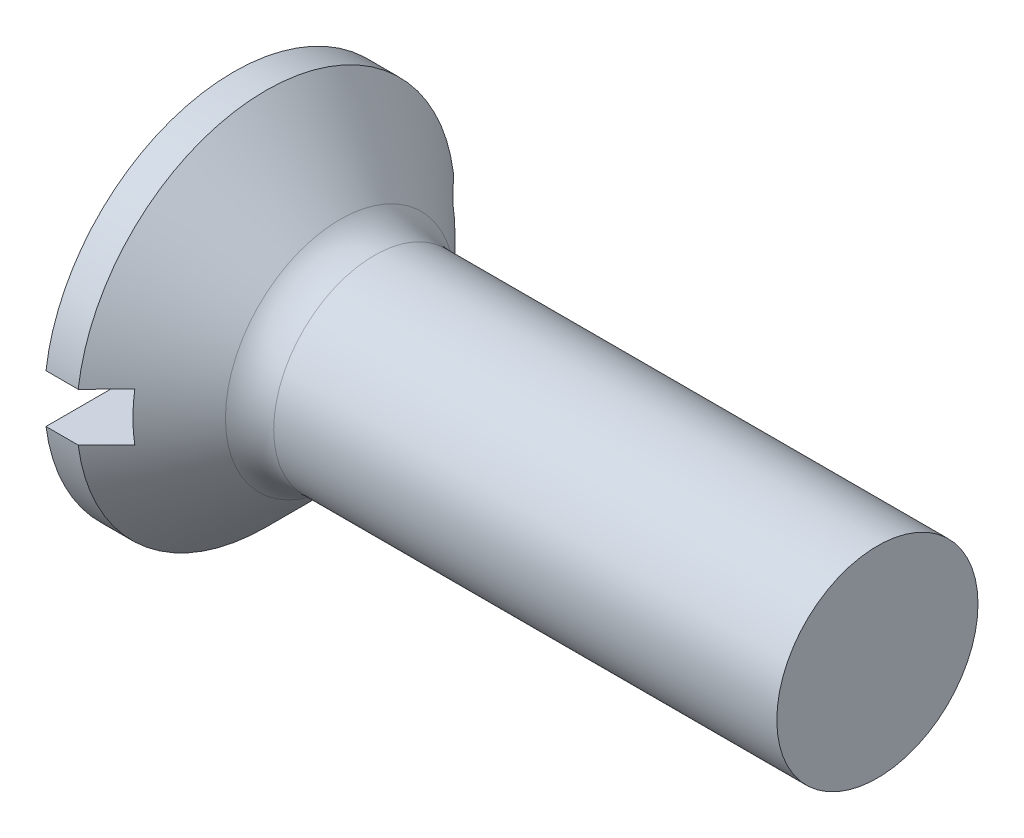
ISO-10303-21;
HEADER;
FILE_DESCRIPTION(('STEP AP214'),'2;1');
FILE_NAME('part.step','',(''),(''),'','','');
FILE_SCHEMA(('AUTOMOTIVE_DESIGN { 1 0 10303 214 1 1 1 1 }'));
ENDSEC;
DATA;
#1=APPLICATION_CONTEXT('core data for automotive mechanical design processes');
#2=APPLICATION_PROTOCOL_DEFINITION('international standard','automotive_design',2000,#1);
#3=PRODUCT_CONTEXT('',#1,'mechanical');
#4=PRODUCT('Part','Part','',(#3));
#5=PRODUCT_RELATED_PRODUCT_CATEGORY('part','',(#4));
#6=PRODUCT_DEFINITION_FORMATION('','',#4);
#7=PRODUCT_DEFINITION_CONTEXT('part definition',#1,'design');
#8=PRODUCT_DEFINITION('design','',#6,#7);
#9=PRODUCT_DEFINITION_SHAPE('','',#8);
#10=(LENGTH_UNIT() NAMED_UNIT(*) SI_UNIT(.MILLI.,.METRE.));
#11=(NAMED_UNIT(*) PLANE_ANGLE_UNIT() SI_UNIT($,.RADIAN.));
#12=(NAMED_UNIT(*) SI_UNIT($,.STERADIAN.) SOLID_ANGLE_UNIT());
#13=UNCERTAINTY_MEASURE_WITH_UNIT(LENGTH_MEASURE(1.E-05),#10,'distance_accuracy_value','');
#14=(GEOMETRIC_REPRESENTATION_CONTEXT(3) GLOBAL_UNCERTAINTY_ASSIGNED_CONTEXT((#13)) GLOBAL_UNIT_ASSIGNED_CONTEXT((#10,
#11,#12)) REPRESENTATION_CONTEXT('',''));
#15=CARTESIAN_POINT('',(0.,0.,0.));
#16=DIRECTION('',(0.,0.,1.));
#17=DIRECTION('',(1.,0.,0.));
#18=AXIS2_PLACEMENT_3D('',#15,#16,#17);
#19=CARTESIAN_POINT('',(0.,0.,0.));
#20=DIRECTION('',(-1.,0.,0.));
#21=DIRECTION('',(0.,0.,1.));
#22=AXIS2_PLACEMENT_3D('',#19,#20,#21);
#23=PLANE('',#22);
#24=DIRECTION('',(0.,0.,-1.));
#25=VECTOR('',#24,1.);
#26=CARTESIAN_POINT('',(0.,0.3,2.35));
#27=LINE('',#26,#25);
#28=CARTESIAN_POINT('',(0.,0.3,2.33077240416133));
#29=VERTEX_POINT('',#28);
#30=CARTESIAN_POINT('',(0.,0.3,-2.33077240416133));
#31=VERTEX_POINT('',#30);
#32=EDGE_CURVE('E172',#29,#31,#27,.T.);
#33=ORIENTED_EDGE('',*,*,#32,.F.);
#34=CARTESIAN_POINT('',(0.,0.,0.));
#35=DIRECTION('',(-1.,0.,0.));
#36=DIRECTION('',(0.,0.,1.));
#37=AXIS2_PLACEMENT_3D('',#34,#35,#36);
#38=CIRCLE('',#37,2.35);
#39=EDGE_CURVE('E116',#29,#31,#38,.T.);
#40=ORIENTED_EDGE('',*,*,#39,.T.);
#41=EDGE_LOOP('',(#33,#40));
#42=FACE_BOUND('',#41,.T.);
#43=ADVANCED_FACE('F35',(#42),#23,.T.);
#44=CARTESIAN_POINT('',(-6.34999999999999,0.,0.));
#45=DIRECTION('',(-1.,0.,0.));
#46=DIRECTION('',(0.,0.,1.));
#47=AXIS2_PLACEMENT_3D('',#44,#45,#46);
#48=CYLINDRICAL_SURFACE('',#47,2.35);
#49=DIRECTION('',(-1.,0.,0.));
#50=VECTOR('',#49,1.);
#51=CARTESIAN_POINT('',(-6.34999999999999,0.3,-2.33077240416133));
#52=LINE('',#51,#50);
#53=CARTESIAN_POINT('',(0.399999999999993,0.3,-2.33077240416135));
#54=VERTEX_POINT('',#53);
#55=EDGE_CURVE('E63',#31,#54,#52,.F.);
#56=ORIENTED_EDGE('',*,*,#55,.F.);
#57=ORIENTED_EDGE('',*,*,#39,.F.);
#58=DIRECTION('',(-1.,0.,0.));
#59=VECTOR('',#58,1.);
#60=CARTESIAN_POINT('',(-6.34999999999999,0.3,2.33077240416133));
#61=LINE('',#60,#59);
#62=CARTESIAN_POINT('',(0.400000000000005,0.3,2.33077240416133));
#63=VERTEX_POINT('',#62);
#64=EDGE_CURVE('E178',#63,#29,#61,.T.);
#65=ORIENTED_EDGE('',*,*,#64,.F.);
#66=CARTESIAN_POINT('',(0.400000000000005,0.,0.));
#67=DIRECTION('',(-1.,0.,0.));
#68=DIRECTION('',(0.,0.,1.));
#69=AXIS2_PLACEMENT_3D('',#66,#67,#68);
#70=CIRCLE('',#69,2.35);
#71=EDGE_CURVE('E110',#63,#54,#70,.T.);
#72=ORIENTED_EDGE('',*,*,#71,.T.);
#73=EDGE_LOOP('',(#56,#57,#65,#72));
#74=FACE_BOUND('',#73,.T.);
#75=ADVANCED_FACE('F156',(#74),#48,.T.);
#76=DIRECTION('',(0.,0.,1.));
#77=VECTOR('',#76,1.);
#78=CARTESIAN_POINT('',(0.,-0.300000000000001,-2.35));
#79=LINE('',#78,#77);
#80=CARTESIAN_POINT('',(0.,-0.300000000000001,-2.33077240416133));
#81=VERTEX_POINT('',#80);
#82=CARTESIAN_POINT('',(0.,-0.300000000000001,2.33077240416133));
#83=VERTEX_POINT('',#82);
#84=EDGE_CURVE('E104',#81,#83,#79,.T.);
#85=ORIENTED_EDGE('',*,*,#84,.F.);
#86=EDGE_CURVE('E112',#81,#83,#38,.T.);
#87=ORIENTED_EDGE('',*,*,#86,.T.);
#88=EDGE_LOOP('',(#85,#87));
#89=FACE_BOUND('',#88,.T.);
#90=ADVANCED_FACE('F158',(#89),#23,.T.);
#91=DIRECTION('',(-1.,0.,0.));
#92=VECTOR('',#91,1.);
#93=CARTESIAN_POINT('',(-6.34999999999999,-0.300000000000001,2.33077240416133));
#94=LINE('',#93,#92);
#95=CARTESIAN_POINT('',(0.399999999999993,-0.300000000000001,2.33077240416135));
#96=VERTEX_POINT('',#95);
#97=EDGE_CURVE('E177',#83,#96,#94,.F.);
#98=ORIENTED_EDGE('',*,*,#97,.F.);
#99=ORIENTED_EDGE('',*,*,#86,.F.);
#100=DIRECTION('',(-1.,0.,0.));
#101=VECTOR('',#100,1.);
#102=CARTESIAN_POINT('',(-6.34999999999999,-0.300000000000001,-2.33077240416133));
#103=LINE('',#102,#101);
#104=CARTESIAN_POINT('',(0.400000000000005,-0.300000000000001,-2.33077240416133));
#105=VERTEX_POINT('',#104);
#106=EDGE_CURVE('E175',#105,#81,#103,.T.);
#107=ORIENTED_EDGE('',*,*,#106,.F.);
#108=EDGE_CURVE('E113',#105,#96,#70,.T.);
#109=ORIENTED_EDGE('',*,*,#108,.T.);
#110=EDGE_LOOP('',(#98,#99,#107,#109));
#111=FACE_BOUND('',#110,.T.);
#112=ADVANCED_FACE('F153',(#111),#48,.T.);
#113=CARTESIAN_POINT('',(0.400000000000005,0.,0.));
#114=DIRECTION('',(-1.,0.,0.));
#115=DIRECTION('',(0.,0.,1.));
#116=AXIS2_PLACEMENT_3D('',#113,#114,#115);
#117=CONICAL_SURFACE('',#116,2.35,0.78539816339745);
#118=CARTESIAN_POINT('',(-2.42800833862551,0.299999999999999,-5.16931043320823));
#119=CARTESIAN_POINT('',(-2.25261841100847,0.299999999999999,-4.99362307651959));
#120=CARTESIAN_POINT('',(-2.07724133757269,0.299999999999999,-4.81792287797167));
#121=CARTESIAN_POINT('',(-1.72652707610118,0.299999999999999,-4.46647837873486));
#122=CARTESIAN_POINT('',(-1.55118988858094,0.299999999999999,-4.29073407753154));
#123=CARTESIAN_POINT('',(-1.20052586084608,0.299999999999999,-3.93913911764998));
#124=CARTESIAN_POINT('',(-1.02519903662008,0.299999999999999,-3.76328844302492));
#125=CARTESIAN_POINT('',(-0.674635250353659,0.299999999999999,-3.41150171139461));
#126=CARTESIAN_POINT('',(-0.499398287263219,0.299999999999999,-3.23556565543604));
#127=CARTESIAN_POINT('',(-0.142742244781546,0.3,-2.87719891061078));
#128=CARTESIAN_POINT('',(0.038671636456695,0.3,-2.69476304903183));
#129=CARTESIAN_POINT('',(0.401243177518264,0.3,-2.32962368901913));
#130=CARTESIAN_POINT('',(0.582400828029133,0.3,-2.14692018132558));
#131=CARTESIAN_POINT('',(0.853701856085655,0.3,-1.87246633098782));
#132=CARTESIAN_POINT('',(0.944055005364719,0.3,-1.78092337661133));
#133=CARTESIAN_POINT('',(1.12454060462918,0.3,-1.59761714970683));
#134=CARTESIAN_POINT('',(1.21467305140061,0.3,-1.50585387400849));
#135=CARTESIAN_POINT('',(1.39455527575801,0.3,-1.32196522643919));
#136=CARTESIAN_POINT('',(1.48430507822803,0.3,-1.229839878887));
#137=CARTESIAN_POINT('',(1.66312457215175,0.3,-1.04493203292002));
#138=CARTESIAN_POINT('',(1.75219428539218,0.3,-0.952149555741564));
#139=CARTESIAN_POINT('',(1.86420471650147,0.3,-0.833484886776327));
#140=CARTESIAN_POINT('',(1.88787598239781,0.3,-0.808293333926217));
#141=CARTESIAN_POINT('',(1.93506265122317,0.3,-0.757763761833925));
#142=CARTESIAN_POINT('',(1.95857805168588,0.3,-0.732425740285937));
#143=CARTESIAN_POINT('',(2.00531964433951,0.3,-0.681650032077844));
#144=CARTESIAN_POINT('',(2.02854656685492,0.3,-0.656213018523777));
#145=CARTESIAN_POINT('',(2.07471756896195,0.3,-0.605084358958985));
#146=CARTESIAN_POINT('',(2.09766165859694,0.3,-0.579392722048694));
#147=CARTESIAN_POINT('',(2.15086468280879,0.3,-0.51888076915938));
#148=CARTESIAN_POINT('',(2.18096450936673,0.3,-0.483920434861271));
#149=CARTESIAN_POINT('',(2.24014710244929,0.3,-0.412740209784395));
#150=CARTESIAN_POINT('',(2.26922201299974,0.3,-0.376513624206164));
#151=CARTESIAN_POINT('',(2.31115781909481,0.3,-0.320521065908703));
#152=CARTESIAN_POINT('',(2.32494116764219,0.3,-0.301451693578296));
#153=CARTESIAN_POINT('',(2.35155128112178,0.3,-0.26260920096928));
#154=CARTESIAN_POINT('',(2.36437673279242,0.3,-0.242835167515917));
#155=CARTESIAN_POINT('',(2.38838369538092,0.3,-0.202548926305904));
#156=CARTESIAN_POINT('',(2.39957972481182,0.3,-0.182045562457895));
#157=CARTESIAN_POINT('',(2.41950326781518,0.3,-0.139898499194679));
#158=CARTESIAN_POINT('',(2.42823853712242,0.3,-0.118258643496494));
#159=CARTESIAN_POINT('',(2.44121464752116,0.3,-0.0756315642330676));
#160=CARTESIAN_POINT('',(2.44577820345638,0.3,-0.0547490856512851));
#161=CARTESIAN_POINT('',(2.45045814550033,0.3,-0.0125607157781819));
#162=CARTESIAN_POINT('',(2.45059819009942,0.3,0.00874231302403852));
#163=CARTESIAN_POINT('',(2.44645713359358,0.3,0.0507745005940994));
#164=CARTESIAN_POINT('',(2.44219645792767,0.3,0.0715058561744324));
#165=CARTESIAN_POINT('',(2.43034285129266,0.3,0.112088788803905));
#166=CARTESIAN_POINT('',(2.42272600867115,0.3,0.131932906155933));
#167=CARTESIAN_POINT('',(2.40627133282176,0.3,0.168480395150473));
#168=CARTESIAN_POINT('',(2.39765896034616,0.3,0.185289560929076));
#169=CARTESIAN_POINT('',(2.3792568253778,0.3,0.218258180915777));
#170=CARTESIAN_POINT('',(2.36946608782077,0.3,0.234417082090524));
#171=CARTESIAN_POINT('',(2.33884369453563,0.3,0.282238068331407));
#172=CARTESIAN_POINT('',(2.3168212428878,0.3,0.313127668084709));
#173=CARTESIAN_POINT('',(2.27098335225628,0.3,0.37396790322838));
#174=CARTESIAN_POINT('',(2.24715273675021,0.3,0.403906685116859));
#175=CARTESIAN_POINT('',(2.19860686699748,0.3,0.462939798598314));
#176=CARTESIAN_POINT('',(2.17389378650274,0.3,0.492035923296734));
#177=CARTESIAN_POINT('',(2.09996652239785,0.3,0.577366539181614));
#178=CARTESIAN_POINT('',(2.04995461423282,0.3,0.632904277681994));
#179=CARTESIAN_POINT('',(1.94893899770814,0.3,0.74307551175472));
#180=CARTESIAN_POINT('',(1.89793511720108,0.3,0.797708847275651));
#181=CARTESIAN_POINT('',(1.79530712664028,0.3,0.906513436614064));
#182=CARTESIAN_POINT('',(1.74368234705581,0.3,0.960684058808777));
#183=CARTESIAN_POINT('',(1.64009874735041,0.3,1.06869576204129));
#184=CARTESIAN_POINT('',(1.58813995368372,0.3,1.12253686853349));
#185=CARTESIAN_POINT('',(1.43299775678761,0.3,1.28265340811134));
#186=CARTESIAN_POINT('',(1.3294988376074,0.3,1.38862292108423));
#187=CARTESIAN_POINT('',(1.12213953407125,0.3,1.60010735015039));
#188=CARTESIAN_POINT('',(1.0182793454916,0.3,1.70562245882804));
#189=CARTESIAN_POINT('',(0.776938614120301,0.3,1.95025555867546));
#190=CARTESIAN_POINT('',(0.639369380971761,0.3,2.08928605536231));
#191=CARTESIAN_POINT('',(0.364008005227606,0.3,2.36712673194879));
#192=CARTESIAN_POINT('',(0.226215861930196,0.3,2.50593691115206));
#193=CARTESIAN_POINT('',(-0.187415945932266,0.3,2.92222808567334));
#194=CARTESIAN_POINT('',(-0.463453894992341,0.3,3.19951203803216));
#195=CARTESIAN_POINT('',(-1.02086601908128,0.3,3.7589880811749));
#196=CARTESIAN_POINT('',(-1.30224437603958,0.3,4.04117600158046));
#197=CARTESIAN_POINT('',(-1.86507745571824,0.3,4.60535323076595));
#198=CARTESIAN_POINT('',(-2.14653214851341,0.3,4.88734256939645));
#199=CARTESIAN_POINT('',(-2.42800833862551,0.3,5.16931043320823));
#200=B_SPLINE_CURVE_WITH_KNOTS('',3,(#118,#119,#120,#121,#122,#123,#124,#125,#126,#127,#128,
#129,#130,#131,#132,#133,#134,#135,#136,#137,#138,#139,#140,#141,#142,#143,#144,#145,#146,#147,
#148,#149,#150,#151,#152,#153,#154,#155,#156,#157,#158,#159,#160,#161,#162,#163,#164,#165,#166,
#167,#168,#169,#170,#171,#172,#173,#174,#175,#176,#177,#178,#179,#180,#181,#182,#183,#184,#185,
#186,#187,#188,#189,#190,#191,#192,#193,#194,#195,#196,#197,#198,#199),.UNSPECIFIED.,.F.,.F.,(4,
2,2,2,2,2,2,2,2,2,2,2,2,2,2,2,2,2,2,2,2,2,2,2,2,2,2,2,2,2,2,2,2,2,2,2,2,2,2,2,4),(0.,
0.744747662727134,1.48950445855312,2.23446524668655,2.97941712212032,3.75126198924283,
4.52313422235859,4.90900225921791,5.29487588223297,5.68072401625056,6.06655973727287,
6.17026308463778,6.27396806903843,6.37730491095521,6.48063807275887,6.61902727243693,
6.75831338375107,6.82888195451737,6.89954556231686,6.96953490884326,7.03930113238932,
7.10304879020665,7.16645544512716,7.22956912206529,7.29313992454909,7.3497401687446,
7.40638757429911,7.5200731788173,7.63484962030853,7.74936057357199,7.97354071854587,
8.19776012127105,8.42224800229592,8.64671831749125,9.09109579101219,9.53526148150464,
10.1220256602753,10.7087916899865,11.8825672231515,13.078073058125,14.2733188423756),.UNSPECIFIED.);
#201=CARTESIAN_POINT('',(0.75,0.3,1.97737199332852));
#202=VERTEX_POINT('',#201);
#203=EDGE_CURVE('E11',#202,#63,#200,.T.);
#204=ORIENTED_EDGE('',*,*,#203,.F.);
#205=CARTESIAN_POINT('',(0.75,0.,0.));
#206=DIRECTION('',(1.,0.,0.));
#207=DIRECTION('',(0.,0.,-1.));
#208=AXIS2_PLACEMENT_3D('',#205,#206,#207);
#209=CIRCLE('',#208,2.);
#210=CARTESIAN_POINT('',(0.75,-0.300000000000001,1.97737199332852));
#211=VERTEX_POINT('',#210);
#212=EDGE_CURVE('E92',#211,#202,#209,.F.);
#213=ORIENTED_EDGE('',*,*,#212,.F.);
#214=CARTESIAN_POINT('',(-2.42800833862551,-0.300000000000001,5.16931043320823));
#215=CARTESIAN_POINT('',(-2.25261841100847,-0.300000000000001,4.9936230765196));
#216=CARTESIAN_POINT('',(-2.0772413375727,-0.300000000000001,4.81792287797168));
#217=CARTESIAN_POINT('',(-1.72652707610118,-0.300000000000001,4.46647837873486));
#218=CARTESIAN_POINT('',(-1.55118988858094,-0.300000000000001,4.29073407753154));
#219=CARTESIAN_POINT('',(-1.20052586084608,-0.300000000000001,3.93913911764998));
#220=CARTESIAN_POINT('',(-1.02519903662009,-0.300000000000001,3.76328844302492));
#221=CARTESIAN_POINT('',(-0.674635250353662,-0.300000000000001,3.41150171139461));
#222=CARTESIAN_POINT('',(-0.499398287263222,-0.300000000000001,3.23556565543605));
#223=CARTESIAN_POINT('',(-0.142742244781549,-0.300000000000001,2.87719891061079));
#224=CARTESIAN_POINT('',(0.0386716364566927,-0.300000000000001,2.69476304903183));
#225=CARTESIAN_POINT('',(0.401243177518262,-0.300000000000001,2.32962368901913));
#226=CARTESIAN_POINT('',(0.582400828029131,-0.300000000000001,2.14692018132558));
#227=CARTESIAN_POINT('',(0.853701856085653,-0.300000000000001,1.87246633098782));
#228=CARTESIAN_POINT('',(0.944055005364718,-0.300000000000001,1.78092337661133));
#229=CARTESIAN_POINT('',(1.12454060462918,-0.300000000000001,1.59761714970683));
#230=CARTESIAN_POINT('',(1.21467305140061,-0.300000000000001,1.50585387400849));
#231=CARTESIAN_POINT('',(1.39455527575801,-0.300000000000001,1.32196522643919));
#232=CARTESIAN_POINT('',(1.48430507822803,-0.300000000000001,1.229839878887));
#233=CARTESIAN_POINT('',(1.66312457215175,-0.300000000000001,1.04493203292002));
#234=CARTESIAN_POINT('',(1.75219428539218,-0.300000000000001,0.952149555741564));
#235=CARTESIAN_POINT('',(1.86420471650147,-0.300000000000001,0.833484886776327));
#236=CARTESIAN_POINT('',(1.8878759823978,-0.300000000000001,0.808293333926217));
#237=CARTESIAN_POINT('',(1.93506265122317,-0.300000000000001,0.757763761833925));
#238=CARTESIAN_POINT('',(1.95857805168588,-0.300000000000001,0.732425740285938));
#239=CARTESIAN_POINT('',(2.00531964433951,-0.300000000000001,0.681650032077844));
#240=CARTESIAN_POINT('',(2.02854656685492,-0.300000000000001,0.656213018523777));
#241=CARTESIAN_POINT('',(2.07471756896195,-0.300000000000001,0.605084358958985));
#242=CARTESIAN_POINT('',(2.09766165859694,-0.300000000000001,0.579392722048694));
#243=CARTESIAN_POINT('',(2.15086468280879,-0.300000000000001,0.51888076915938));
#244=CARTESIAN_POINT('',(2.18096450936673,-0.300000000000001,0.48392043486127));
#245=CARTESIAN_POINT('',(2.24014710244929,-0.300000000000001,0.412740209784394));
#246=CARTESIAN_POINT('',(2.26922201299974,-0.300000000000001,0.376513624206163));
#247=CARTESIAN_POINT('',(2.31115781909481,-0.300000000000001,0.320521065908702));
#248=CARTESIAN_POINT('',(2.32494116764219,-0.300000000000001,0.301451693578294));
#249=CARTESIAN_POINT('',(2.35155128112178,-0.300000000000001,0.262609200969279));
#250=CARTESIAN_POINT('',(2.36437673279242,-0.300000000000001,0.242835167515916));
#251=CARTESIAN_POINT('',(2.38838369538092,-0.300000000000001,0.202548926305904));
#252=CARTESIAN_POINT('',(2.39957972481182,-0.300000000000001,0.182045562457894));
#253=CARTESIAN_POINT('',(2.41950326781518,-0.300000000000001,0.139898499194678));
#254=CARTESIAN_POINT('',(2.42823853712242,-0.300000000000001,0.118258643496493));
#255=CARTESIAN_POINT('',(2.44121464752116,-0.300000000000001,0.0756315642330665));
#256=CARTESIAN_POINT('',(2.44577820345638,-0.300000000000001,0.054749085651284));
#257=CARTESIAN_POINT('',(2.45045814550033,-0.300000000000001,0.0125607157781809));
#258=CARTESIAN_POINT('',(2.45059819009942,-0.300000000000001,-0.00874231302403949));
#259=CARTESIAN_POINT('',(2.44645713359358,-0.300000000000001,-0.0507745005941003));
#260=CARTESIAN_POINT('',(2.44219645792767,-0.300000000000001,-0.0715058561744333));
#261=CARTESIAN_POINT('',(2.43034285129266,-0.300000000000001,-0.112088788803905));
#262=CARTESIAN_POINT('',(2.42272600867114,-0.300000000000001,-0.131932906155934));
#263=CARTESIAN_POINT('',(2.40627133282176,-0.300000000000001,-0.168480395150474));
#264=CARTESIAN_POINT('',(2.39765896034615,-0.300000000000001,-0.185289560929078));
#265=CARTESIAN_POINT('',(2.3792568253778,-0.300000000000001,-0.218258180915779));
#266=CARTESIAN_POINT('',(2.36946608782076,-0.300000000000001,-0.234417082090525));
#267=CARTESIAN_POINT('',(2.33884369453563,-0.300000000000001,-0.282238068331409));
#268=CARTESIAN_POINT('',(2.3168212428878,-0.300000000000001,-0.313127668084711));
#269=CARTESIAN_POINT('',(2.27098335225628,-0.300000000000001,-0.373967903228382));
#270=CARTESIAN_POINT('',(2.2471527367502,-0.300000000000001,-0.403906685116861));
#271=CARTESIAN_POINT('',(2.19860686699748,-0.300000000000001,-0.462939798598316));
#272=CARTESIAN_POINT('',(2.17389378650273,-0.300000000000001,-0.492035923296737));
#273=CARTESIAN_POINT('',(2.09996652239784,-0.300000000000001,-0.577366539181617));
#274=CARTESIAN_POINT('',(2.04995461423282,-0.300000000000001,-0.632904277681997));
#275=CARTESIAN_POINT('',(1.94893899770814,-0.300000000000001,-0.743075511754724));
#276=CARTESIAN_POINT('',(1.89793511720108,-0.300000000000001,-0.797708847275656));
#277=CARTESIAN_POINT('',(1.79530712664027,-0.300000000000001,-0.90651343661407));
#278=CARTESIAN_POINT('',(1.74368234705581,-0.300000000000001,-0.960684058808783));
#279=CARTESIAN_POINT('',(1.64009874735041,-0.300000000000001,-1.06869576204129));
#280=CARTESIAN_POINT('',(1.58813995368371,-0.300000000000001,-1.1225368685335));
#281=CARTESIAN_POINT('',(1.4329977567876,-0.300000000000001,-1.28265340811134));
#282=CARTESIAN_POINT('',(1.32949883760739,-0.300000000000001,-1.38862292108423));
#283=CARTESIAN_POINT('',(1.12213953407124,-0.300000000000001,-1.6001073501504));
#284=CARTESIAN_POINT('',(1.01827934549159,-0.300000000000001,-1.70562245882805));
#285=CARTESIAN_POINT('',(0.776938614120291,-0.300000000000001,-1.95025555867546));
#286=CARTESIAN_POINT('',(0.639369380971752,-0.300000000000001,-2.08928605536231));
#287=CARTESIAN_POINT('',(0.364008005227598,-0.300000000000001,-2.3671267319488));
#288=CARTESIAN_POINT('',(0.226215861930187,-0.300000000000001,-2.50593691115207));
#289=CARTESIAN_POINT('',(-0.187415945932274,-0.300000000000001,-2.92222808567335));
#290=CARTESIAN_POINT('',(-0.463453894992349,-0.300000000000001,-3.19951203803217));
#291=CARTESIAN_POINT('',(-1.02086601908129,-0.300000000000001,-3.75898808117491));
#292=CARTESIAN_POINT('',(-1.30224437603959,-0.300000000000001,-4.04117600158047));
#293=CARTESIAN_POINT('',(-1.86507745571824,-0.300000000000001,-4.60535323076595));
#294=CARTESIAN_POINT('',(-2.14653214851341,-0.300000000000001,-4.88734256939645));
#295=CARTESIAN_POINT('',(-2.42800833862551,-0.300000000000001,-5.16931043320823));
#296=B_SPLINE_CURVE_WITH_KNOTS('',3,(#214,#215,#216,#217,#218,#219,#220,#221,#222,#223,#224,
#225,#226,#227,#228,#229,#230,#231,#232,#233,#234,#235,#236,#237,#238,#239,#240,#241,#242,#243,
#244,#245,#246,#247,#248,#249,#250,#251,#252,#253,#254,#255,#256,#257,#258,#259,#260,#261,#262,
#263,#264,#265,#266,#267,#268,#269,#270,#271,#272,#273,#274,#275,#276,#277,#278,#279,#280,#281,
#282,#283,#284,#285,#286,#287,#288,#289,#290,#291,#292,#293,#294,#295),.UNSPECIFIED.,.F.,.F.,(4,
2,2,2,2,2,2,2,2,2,2,2,2,2,2,2,2,2,2,2,2,2,2,2,2,2,2,2,2,2,2,2,2,2,2,2,2,2,2,2,4),(0.,
0.744747662727132,1.48950445855311,2.23446524668655,2.97941712212031,3.75126198924283,
4.52313422235859,4.9090022592179,5.29487588223297,5.68072401625056,6.06655973727287,
6.17026308463778,6.27396806903843,6.37730491095521,6.48063807275887,6.61902727243693,
6.75831338375107,6.82888195451738,6.89954556231686,6.96953490884326,7.03930113238933,
7.10304879020665,7.16645544512716,7.22956912206529,7.29313992454909,7.3497401687446,
7.40638757429911,7.5200731788173,7.63484962030853,7.74936057357199,7.97354071854587,
8.19776012127106,8.42224800229593,8.64671831749126,9.0910957910122,9.53526148150465,
10.1220256602753,10.7087916899866,11.8825672231515,13.078073058125,14.2733188423756),.UNSPECIFIED.);
#297=EDGE_CURVE('E49',#96,#211,#296,.T.);
#298=ORIENTED_EDGE('',*,*,#297,.F.);
#299=ORIENTED_EDGE('',*,*,#108,.F.);
#300=CARTESIAN_POINT('',(0.75,-0.300000000000001,-1.97737199332852));
#301=VERTEX_POINT('',#300);
#302=EDGE_CURVE('E128',#301,#105,#296,.T.);
#303=ORIENTED_EDGE('',*,*,#302,.F.);
#304=CARTESIAN_POINT('',(0.75,0.3,-1.97737199332852));
#305=VERTEX_POINT('',#304);
#306=EDGE_CURVE('E100',#305,#301,#209,.F.);
#307=ORIENTED_EDGE('',*,*,#306,.F.);
#308=EDGE_CURVE('E39',#54,#305,#200,.T.);
#309=ORIENTED_EDGE('',*,*,#308,.F.);
#310=ORIENTED_EDGE('',*,*,#71,.F.);
#311=EDGE_LOOP('',(#204,#213,#298,#299,#303,#307,#309,#310));
#312=FACE_BOUND('',#311,.T.);
#313=CARTESIAN_POINT('',(1.32426406871193,0.,0.));
#314=DIRECTION('',(-1.,0.,0.));
#315=DIRECTION('',(0.,0.,1.));
#316=AXIS2_PLACEMENT_3D('',#313,#314,#315);
#317=CIRCLE('',#316,1.42573593128807);
#318=CARTESIAN_POINT('',(1.32426406871193,0.,1.42573593128807));
#319=VERTEX_POINT('',#318);
#320=EDGE_CURVE('E123',#319,#319,#317,.T.);
#321=ORIENTED_EDGE('',*,*,#320,.T.);
#322=EDGE_LOOP('',(#321));
#323=FACE_BOUND('',#322,.T.);
#324=ADVANCED_FACE('F107',(#312,#323),#117,.T.);
#325=CARTESIAN_POINT('',(-6.34999999999999,0.,0.));
#326=DIRECTION('',(-1.,0.,0.));
#327=DIRECTION('',(0.,0.,1.));
#328=AXIS2_PLACEMENT_3D('',#325,#326,#327);
#329=CYLINDRICAL_SURFACE('',#328,1.25);
#330=CARTESIAN_POINT('',(1.74852813742386,0.,0.));
#331=DIRECTION('',(-1.,0.,0.));
#332=DIRECTION('',(0.,0.,1.));
#333=AXIS2_PLACEMENT_3D('',#330,#331,#332);
#334=CIRCLE('',#333,1.25);
#335=CARTESIAN_POINT('',(1.74852813742386,0.,1.25));
#336=VERTEX_POINT('',#335);
#337=EDGE_CURVE('E126',#336,#336,#334,.F.);
#338=ORIENTED_EDGE('',*,*,#337,.T.);
#339=EDGE_LOOP('',(#338));
#340=FACE_BOUND('',#339,.T.);
#341=CARTESIAN_POINT('',(8.,0.,0.));
#342=DIRECTION('',(-1.,0.,0.));
#343=DIRECTION('',(0.,0.,1.));
#344=AXIS2_PLACEMENT_3D('',#341,#342,#343);
#345=CIRCLE('',#344,1.25);
#346=CARTESIAN_POINT('',(8.,0.,1.25));
#347=VERTEX_POINT('',#346);
#348=EDGE_CURVE('E119',#347,#347,#345,.T.);
#349=ORIENTED_EDGE('',*,*,#348,.T.);
#350=EDGE_LOOP('',(#349));
#351=FACE_BOUND('',#350,.T.);
#352=ADVANCED_FACE('F146',(#340,#351),#329,.T.);
#353=CARTESIAN_POINT('',(8.,1.25,0.));
#354=DIRECTION('',(1.,0.,0.));
#355=DIRECTION('',(0.,0.,-1.));
#356=AXIS2_PLACEMENT_3D('',#353,#354,#355);
#357=PLANE('',#356);
#358=ORIENTED_EDGE('',*,*,#348,.F.);
#359=EDGE_LOOP('',(#358));
#360=FACE_BOUND('',#359,.T.);
#361=ADVANCED_FACE('F144',(#360),#357,.T.);
#362=CARTESIAN_POINT('',(1.74852813742386,0.,0.));
#363=DIRECTION('',(-1.,0.,0.));
#364=DIRECTION('',(0.,0.,1.));
#365=AXIS2_PLACEMENT_3D('',#362,#363,#364);
#366=TOROIDAL_SURFACE('',#365,1.85,0.6);
#367=ORIENTED_EDGE('',*,*,#337,.F.);
#368=EDGE_LOOP('',(#367));
#369=FACE_BOUND('',#368,.T.);
#370=ORIENTED_EDGE('',*,*,#320,.F.);
#371=EDGE_LOOP('',(#370));
#372=FACE_BOUND('',#371,.T.);
#373=ADVANCED_FACE('F37',(#369,#372),#366,.F.);
#374=CARTESIAN_POINT('',(0.75,0.3,2.35));
#375=DIRECTION('',(0.,1.,0.));
#376=DIRECTION('',(0.,0.,1.));
#377=AXIS2_PLACEMENT_3D('',#374,#375,#376);
#378=PLANE('',#377);
#379=ORIENTED_EDGE('',*,*,#55,.T.);
#380=ORIENTED_EDGE('',*,*,#308,.T.);
#381=DIRECTION('',(0.,0.,-1.));
#382=VECTOR('',#381,1.);
#383=CARTESIAN_POINT('',(0.75,0.3,2.35));
#384=LINE('',#383,#382);
#385=EDGE_CURVE('E56',#202,#305,#384,.T.);
#386=ORIENTED_EDGE('',*,*,#385,.F.);
#387=ORIENTED_EDGE('',*,*,#203,.T.);
#388=ORIENTED_EDGE('',*,*,#64,.T.);
#389=ORIENTED_EDGE('',*,*,#32,.T.);
#390=EDGE_LOOP('',(#379,#380,#386,#387,#388,#389));
#391=FACE_BOUND('',#390,.T.);
#392=ADVANCED_FACE('F101',(#391),#378,.F.);
#393=CARTESIAN_POINT('',(0.75,-0.300000000000001,-2.35));
#394=DIRECTION('',(0.,-1.,0.));
#395=DIRECTION('',(0.,0.,-1.));
#396=AXIS2_PLACEMENT_3D('',#393,#394,#395);
#397=PLANE('',#396);
#398=ORIENTED_EDGE('',*,*,#97,.T.);
#399=ORIENTED_EDGE('',*,*,#297,.T.);
#400=DIRECTION('',(0.,0.,1.));
#401=VECTOR('',#400,1.);
#402=CARTESIAN_POINT('',(0.75,-0.300000000000001,-2.35));
#403=LINE('',#402,#401);
#404=EDGE_CURVE('E95',#301,#211,#403,.T.);
#405=ORIENTED_EDGE('',*,*,#404,.F.);
#406=ORIENTED_EDGE('',*,*,#302,.T.);
#407=ORIENTED_EDGE('',*,*,#106,.T.);
#408=ORIENTED_EDGE('',*,*,#84,.T.);
#409=EDGE_LOOP('',(#398,#399,#405,#406,#407,#408));
#410=FACE_BOUND('',#409,.T.);
#411=ADVANCED_FACE('F136',(#410),#397,.F.);
#412=CARTESIAN_POINT('',(0.75,-0.300000000000001,-2.35));
#413=DIRECTION('',(1.,0.,0.));
#414=DIRECTION('',(0.,0.,-1.));
#415=AXIS2_PLACEMENT_3D('',#412,#413,#414);
#416=PLANE('',#415);
#417=ORIENTED_EDGE('',*,*,#212,.T.);
#418=ORIENTED_EDGE('',*,*,#385,.T.);
#419=ORIENTED_EDGE('',*,*,#306,.T.);
#420=ORIENTED_EDGE('',*,*,#404,.T.);
#421=EDGE_LOOP('',(#417,#418,#419,#420));
#422=FACE_BOUND('',#421,.T.);
#423=ADVANCED_FACE('F93',(#422),#416,.F.);
#424=CLOSED_SHELL('',(#43,#75,#90,#112,#324,#352,#361,#373,#392,#411,#423));
#425=MANIFOLD_SOLID_BREP('B2',#424);
#426=ADVANCED_BREP_SHAPE_REPRESENTATION('',(#18,#425),#14);
#427=SHAPE_DEFINITION_REPRESENTATION(#9,#426);
ENDSEC;
END-ISO-10303-21;
